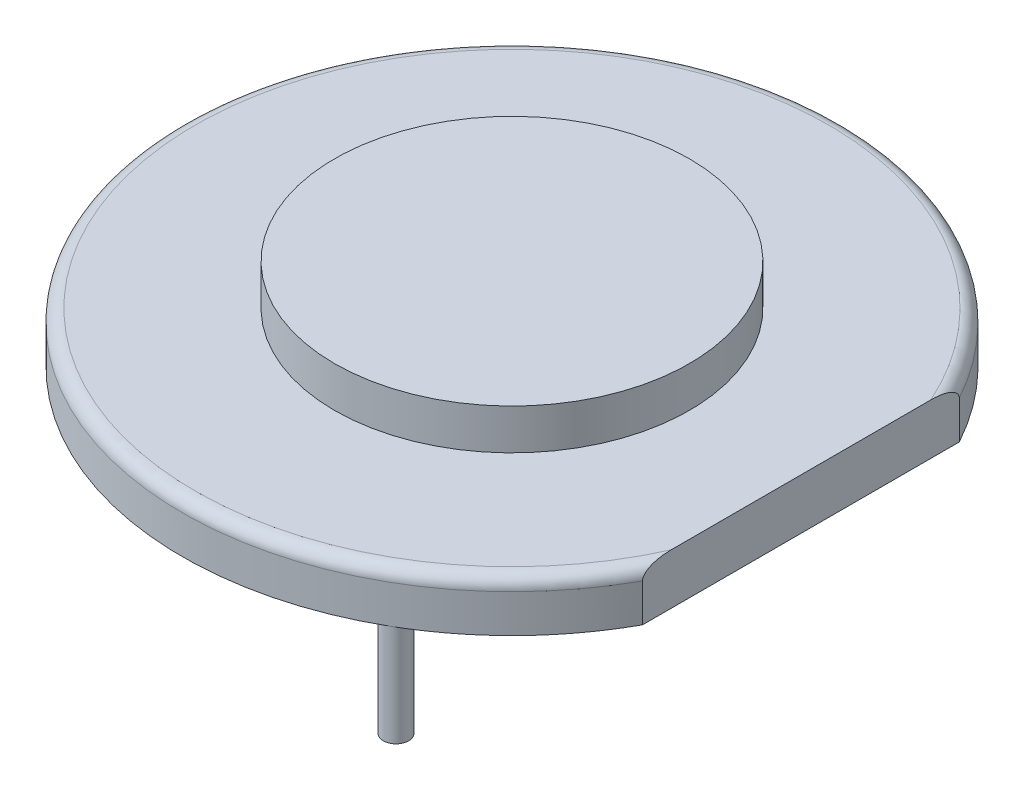
ISO-10303-21;
HEADER;
FILE_DESCRIPTION(('STEP AP214'),'2;1');
FILE_NAME('part.step','',(''),(''),'','','');
FILE_SCHEMA(('AUTOMOTIVE_DESIGN { 1 0 10303 214 1 1 1 1 }'));
ENDSEC;
DATA;
#1=APPLICATION_CONTEXT('core data for automotive mechanical design processes');
#2=APPLICATION_PROTOCOL_DEFINITION('international standard','automotive_design',2000,#1);
#3=PRODUCT_CONTEXT('',#1,'mechanical');
#4=PRODUCT('Part','Part','',(#3));
#5=PRODUCT_RELATED_PRODUCT_CATEGORY('part','',(#4));
#6=PRODUCT_DEFINITION_FORMATION('','',#4);
#7=PRODUCT_DEFINITION_CONTEXT('part definition',#1,'design');
#8=PRODUCT_DEFINITION('design','',#6,#7);
#9=PRODUCT_DEFINITION_SHAPE('','',#8);
#10=(LENGTH_UNIT() NAMED_UNIT(*) SI_UNIT(.MILLI.,.METRE.));
#11=(NAMED_UNIT(*) PLANE_ANGLE_UNIT() SI_UNIT($,.RADIAN.));
#12=(NAMED_UNIT(*) SI_UNIT($,.STERADIAN.) SOLID_ANGLE_UNIT());
#13=UNCERTAINTY_MEASURE_WITH_UNIT(LENGTH_MEASURE(1.E-05),#10,'distance_accuracy_value','');
#14=(GEOMETRIC_REPRESENTATION_CONTEXT(3) GLOBAL_UNCERTAINTY_ASSIGNED_CONTEXT((#13)) GLOBAL_UNIT_ASSIGNED_CONTEXT((#10,
#11,#12)) REPRESENTATION_CONTEXT('',''));
#15=CARTESIAN_POINT('',(0.,0.,0.));
#16=DIRECTION('',(0.,0.,1.));
#17=DIRECTION('',(1.,0.,0.));
#18=AXIS2_PLACEMENT_3D('',#15,#16,#17);
#19=CARTESIAN_POINT('',(0.,-1.,0.));
#20=DIRECTION('',(0.,1.,0.));
#21=DIRECTION('',(0.,0.,1.));
#22=AXIS2_PLACEMENT_3D('',#19,#20,#21);
#23=CYLINDRICAL_SURFACE('',#22,6.5);
#24=DIRECTION('',(0.,-1.,0.));
#25=VECTOR('',#24,1.);
#26=CARTESIAN_POINT('',(5.7,0.,3.12409987036266));
#27=LINE('',#26,#25);
#28=CARTESIAN_POINT('',(5.7,-0.25,3.12409987036266));
#29=VERTEX_POINT('',#28);
#30=CARTESIAN_POINT('',(5.7,-1.,3.12409987036266));
#31=VERTEX_POINT('',#30);
#32=EDGE_CURVE('E108',#29,#31,#27,.T.);
#33=ORIENTED_EDGE('',*,*,#32,.F.);
#34=CARTESIAN_POINT('',(0.,-0.25,0.));
#35=DIRECTION('',(0.,-1.,0.));
#36=DIRECTION('',(0.,0.,-1.));
#37=AXIS2_PLACEMENT_3D('',#34,#35,#36);
#38=CIRCLE('',#37,6.5);
#39=CARTESIAN_POINT('',(5.7,-0.25,-3.12409987036267));
#40=VERTEX_POINT('',#39);
#41=EDGE_CURVE('E122',#29,#40,#38,.T.);
#42=ORIENTED_EDGE('',*,*,#41,.T.);
#43=DIRECTION('',(0.,-1.,0.));
#44=VECTOR('',#43,1.);
#45=CARTESIAN_POINT('',(5.7,0.,-3.12409987036267));
#46=LINE('',#45,#44);
#47=CARTESIAN_POINT('',(5.7,-1.,-3.12409987036267));
#48=VERTEX_POINT('',#47);
#49=EDGE_CURVE('E296',#40,#48,#46,.T.);
#50=ORIENTED_EDGE('',*,*,#49,.T.);
#51=CARTESIAN_POINT('',(0.,-1.,0.));
#52=DIRECTION('',(0.,-1.,0.));
#53=DIRECTION('',(0.,0.,-1.));
#54=AXIS2_PLACEMENT_3D('',#51,#52,#53);
#55=CIRCLE('',#54,6.5);
#56=CARTESIAN_POINT('',(3.24999999999995,-1.,-5.62916512459888));
#57=VERTEX_POINT('',#56);
#58=EDGE_CURVE('E101',#57,#48,#55,.T.);
#59=ORIENTED_EDGE('',*,*,#58,.F.);
#60=CARTESIAN_POINT('',(-6.5,-1.,0.));
#61=VERTEX_POINT('',#60);
#62=EDGE_CURVE('E99',#61,#57,#55,.T.);
#63=ORIENTED_EDGE('',*,*,#62,.F.);
#64=CARTESIAN_POINT('',(3.25000000000003,-1.,5.62916512459884));
#65=VERTEX_POINT('',#64);
#66=EDGE_CURVE('E87',#65,#61,#55,.T.);
#67=ORIENTED_EDGE('',*,*,#66,.F.);
#68=EDGE_CURVE('E98',#31,#65,#55,.T.);
#69=ORIENTED_EDGE('',*,*,#68,.F.);
#70=EDGE_LOOP('',(#33,#42,#50,#59,#63,#67,#69));
#71=FACE_BOUND('',#70,.T.);
#72=ADVANCED_FACE('F43',(#71),#23,.T.);
#73=CARTESIAN_POINT('',(0.,-1.,0.));
#74=DIRECTION('',(0.,-1.,0.));
#75=DIRECTION('',(0.,0.,-1.));
#76=AXIS2_PLACEMENT_3D('',#73,#74,#75);
#77=PLANE('',#76);
#78=ORIENTED_EDGE('',*,*,#68,.T.);
#79=CARTESIAN_POINT('',(3.12500000000002,-1.,5.41265877365273));
#80=DIRECTION('',(0.,-1.,0.));
#81=DIRECTION('',(0.,0.,-1.));
#82=AXIS2_PLACEMENT_3D('',#79,#80,#81);
#83=CIRCLE('',#82,0.25);
#84=EDGE_CURVE('E94',#65,#65,#83,.T.);
#85=ORIENTED_EDGE('',*,*,#84,.F.);
#86=ORIENTED_EDGE('',*,*,#66,.T.);
#87=CARTESIAN_POINT('',(-6.25,-1.,0.));
#88=DIRECTION('',(0.,-1.,0.));
#89=DIRECTION('',(0.,0.,-1.));
#90=AXIS2_PLACEMENT_3D('',#87,#88,#89);
#91=CIRCLE('',#90,0.25);
#92=EDGE_CURVE('E93',#61,#61,#91,.T.);
#93=ORIENTED_EDGE('',*,*,#92,.F.);
#94=ORIENTED_EDGE('',*,*,#62,.T.);
#95=CARTESIAN_POINT('',(3.12499999999995,-1.,-5.41265877365277));
#96=DIRECTION('',(0.,-1.,0.));
#97=DIRECTION('',(0.,0.,-1.));
#98=AXIS2_PLACEMENT_3D('',#95,#96,#97);
#99=CIRCLE('',#98,0.25);
#100=EDGE_CURVE('E308',#57,#57,#99,.T.);
#101=ORIENTED_EDGE('',*,*,#100,.F.);
#102=ORIENTED_EDGE('',*,*,#58,.T.);
#103=DIRECTION('',(0.,0.,1.));
#104=VECTOR('',#103,1.);
#105=CARTESIAN_POINT('',(5.7,-1.,0.));
#106=LINE('',#105,#104);
#107=EDGE_CURVE('E300',#48,#31,#106,.T.);
#108=ORIENTED_EDGE('',*,*,#107,.T.);
#109=EDGE_LOOP('',(#78,#85,#86,#93,#94,#101,#102,#108));
#110=FACE_BOUND('',#109,.T.);
#111=ADVANCED_FACE('F90',(#110),#77,.T.);
#112=CARTESIAN_POINT('',(0.,0.,0.));
#113=DIRECTION('',(0.,-1.,0.));
#114=DIRECTION('',(0.,0.,-1.));
#115=AXIS2_PLACEMENT_3D('',#112,#113,#114);
#116=PLANE('',#115);
#117=CARTESIAN_POINT('',(0.,0.,0.));
#118=DIRECTION('',(0.,1.,0.));
#119=DIRECTION('',(0.,0.,1.));
#120=AXIS2_PLACEMENT_3D('',#117,#118,#119);
#121=CIRCLE('',#120,3.5);
#122=CARTESIAN_POINT('',(0.,0.,3.5));
#123=VERTEX_POINT('',#122);
#124=EDGE_CURVE('E112',#123,#123,#121,.T.);
#125=ORIENTED_EDGE('',*,*,#124,.F.);
#126=EDGE_LOOP('',(#125));
#127=FACE_BOUND('',#126,.T.);
#128=DIRECTION('',(0.,0.,1.));
#129=VECTOR('',#128,1.);
#130=CARTESIAN_POINT('',(5.7,0.,0.));
#131=LINE('',#130,#129);
#132=CARTESIAN_POINT('',(5.7,0.,-2.56368874865885));
#133=VERTEX_POINT('',#132);
#134=CARTESIAN_POINT('',(5.7,0.,2.56368874865885));
#135=VERTEX_POINT('',#134);
#136=EDGE_CURVE('E294',#133,#135,#131,.T.);
#137=ORIENTED_EDGE('',*,*,#136,.F.);
#138=CARTESIAN_POINT('',(0.,0.,0.));
#139=DIRECTION('',(0.,-1.,0.));
#140=DIRECTION('',(0.,0.,-1.));
#141=AXIS2_PLACEMENT_3D('',#138,#139,#140);
#142=CIRCLE('',#141,6.25);
#143=EDGE_CURVE('E11',#133,#135,#142,.F.);
#144=ORIENTED_EDGE('',*,*,#143,.T.);
#145=EDGE_LOOP('',(#137,#144));
#146=FACE_BOUND('',#145,.T.);
#147=ADVANCED_FACE('F149',(#127,#146),#116,.F.);
#148=CARTESIAN_POINT('',(0.,0.8,0.));
#149=DIRECTION('',(0.,-1.,0.));
#150=DIRECTION('',(0.,0.,-1.));
#151=AXIS2_PLACEMENT_3D('',#148,#149,#150);
#152=CYLINDRICAL_SURFACE('',#151,3.5);
#153=CARTESIAN_POINT('',(0.,0.8,0.));
#154=DIRECTION('',(0.,1.,0.));
#155=DIRECTION('',(0.,0.,1.));
#156=AXIS2_PLACEMENT_3D('',#153,#154,#155);
#157=CIRCLE('',#156,3.5);
#158=CARTESIAN_POINT('',(0.,0.8,3.5));
#159=VERTEX_POINT('',#158);
#160=EDGE_CURVE('E116',#159,#159,#157,.T.);
#161=ORIENTED_EDGE('',*,*,#160,.F.);
#162=EDGE_LOOP('',(#161));
#163=FACE_BOUND('',#162,.T.);
#164=ORIENTED_EDGE('',*,*,#124,.T.);
#165=EDGE_LOOP('',(#164));
#166=FACE_BOUND('',#165,.T.);
#167=ADVANCED_FACE('F152',(#163,#166),#152,.T.);
#168=CARTESIAN_POINT('',(0.,0.8,0.));
#169=DIRECTION('',(0.,1.,0.));
#170=DIRECTION('',(0.,0.,1.));
#171=AXIS2_PLACEMENT_3D('',#168,#169,#170);
#172=PLANE('',#171);
#173=ORIENTED_EDGE('',*,*,#160,.T.);
#174=EDGE_LOOP('',(#173));
#175=FACE_BOUND('',#174,.T.);
#176=ADVANCED_FACE('F144',(#175),#172,.T.);
#177=CARTESIAN_POINT('',(5.7,0.,0.));
#178=DIRECTION('',(1.,0.,0.));
#179=DIRECTION('',(0.,0.,-1.));
#180=AXIS2_PLACEMENT_3D('',#177,#178,#179);
#181=PLANE('',#180);
#182=ORIENTED_EDGE('',*,*,#49,.F.);
#183=CARTESIAN_POINT('',(5.7,-0.25,-3.12409987036267));
#184=CARTESIAN_POINT('',(5.7,-0.24270139711949,-3.12411790347937));
#185=CARTESIAN_POINT('',(5.7,-0.235425627069818,-3.12343582252596));
#186=CARTESIAN_POINT('',(5.7,-0.221173546532506,-3.12083654088536));
#187=CARTESIAN_POINT('',(5.7,-0.214194898182048,-3.11893234750161));
#188=CARTESIAN_POINT('',(5.7,-0.199088632378106,-3.11349263803758));
#189=CARTESIAN_POINT('',(5.7,-0.191060525611116,-3.10968465857683));
#190=CARTESIAN_POINT('',(5.7,-0.175706882548516,-3.10081499618159));
#191=CARTESIAN_POINT('',(5.7,-0.168384522831868,-3.09574798152024));
#192=CARTESIAN_POINT('',(5.7,-0.150718389128591,-3.08170819210007));
#193=CARTESIAN_POINT('',(5.7,-0.140880464647974,-3.07210455841439));
#194=CARTESIAN_POINT('',(5.7,-0.12275430626118,-3.05155610756302));
#195=CARTESIAN_POINT('',(5.7,-0.114468923105735,-3.04060888312734));
#196=CARTESIAN_POINT('',(5.7,-0.0925738390211234,-3.00803071204067));
#197=CARTESIAN_POINT('',(5.7,-0.0805516136635355,-2.98534354321277));
#198=CARTESIAN_POINT('',(5.7,-0.0596901424959992,-2.93846565774986));
#199=CARTESIAN_POINT('',(5.7,-0.0508732469623095,-2.91426571249646));
#200=CARTESIAN_POINT('',(5.7,-0.0350891539319967,-2.86296115134918));
#201=CARTESIAN_POINT('',(5.7,-0.0283504707873799,-2.83578733005097));
#202=CARTESIAN_POINT('',(5.7,-0.0172238791939065,-2.78092884006502));
#203=CARTESIAN_POINT('',(5.7,-0.0128404470011123,-2.75324330136007));
#204=CARTESIAN_POINT('',(5.7,-0.00616416122222058,-2.69856207103815));
#205=CARTESIAN_POINT('',(5.7,-0.0038067343169454,-2.6715739911406));
#206=CARTESIAN_POINT('',(5.7,-0.000735113779256635,-2.61761550312378));
#207=CARTESIAN_POINT('',(5.7,-1.40932183584515E-05,-2.59064549260658));
#208=CARTESIAN_POINT('',(5.7,0.,-2.56368874865885));
#209=B_SPLINE_CURVE_WITH_KNOTS('',3,(#183,#184,#185,#186,#187,#188,#189,#190,#191,#192,#193,
#194,#195,#196,#197,#198,#199,#200,#201,#202,#203,#204,#205,#206,#207,#208),.UNSPECIFIED.,.F.,
.F.,(4,2,2,2,2,2,2,2,2,2,2,2,4),(0.,0.0218270475864105,0.0434255514929194,0.0699346489562582,
0.0965579789665009,0.137569956262466,0.178656516554561,0.255254109403615,0.332376001142889,
0.416226983471425,0.500236769522998,0.581457537877483,0.662338833271093),.UNSPECIFIED.);
#210=EDGE_CURVE('E53',#40,#133,#209,.T.);
#211=ORIENTED_EDGE('',*,*,#210,.T.);
#212=ORIENTED_EDGE('',*,*,#136,.T.);
#213=CARTESIAN_POINT('',(5.7,0.,2.56368874865885));
#214=CARTESIAN_POINT('',(5.7,-1.4108370724459E-05,2.59058807505943));
#215=CARTESIAN_POINT('',(5.7,-0.00073207241316092,2.61750122529947));
#216=CARTESIAN_POINT('',(5.7,-0.00378976378290127,2.67133747283605));
#217=CARTESIAN_POINT('',(5.7,-0.00613574869164745,2.69826020651981));
#218=CARTESIAN_POINT('',(5.7,-0.0126636068477949,2.75186289164603));
#219=CARTESIAN_POINT('',(5.7,-0.0168437523248294,2.77854304751094));
#220=CARTESIAN_POINT('',(5.7,-0.0273775349103727,2.83144139799893));
#221=CARTESIAN_POINT('',(5.7,-0.033727337840529,2.85766032233706));
#222=CARTESIAN_POINT('',(5.7,-0.0462161795476339,2.89951849573819));
#223=CARTESIAN_POINT('',(5.7,-0.051524705692199,2.91540476003664));
#224=CARTESIAN_POINT('',(5.7,-0.0634049250575088,2.94677451747356));
#225=CARTESIAN_POINT('',(5.7,-0.0699812768017597,2.96225627839876));
#226=CARTESIAN_POINT('',(5.7,-0.0864288382515606,2.99620701488635));
#227=CARTESIAN_POINT('',(5.7,-0.0967125165836328,3.0144801670197));
#228=CARTESIAN_POINT('',(5.7,-0.120299401512833,3.04895021630178));
#229=CARTESIAN_POINT('',(5.7,-0.133580809238669,3.06516084286848));
#230=CARTESIAN_POINT('',(5.7,-0.155051789357852,3.08515083783441));
#231=CARTESIAN_POINT('',(5.7,-0.161643699430429,3.09063525165643));
#232=CARTESIAN_POINT('',(5.7,-0.175530582253784,3.10065794767847));
#233=CARTESIAN_POINT('',(5.7,-0.182825874042199,3.10519579755892));
#234=CARTESIAN_POINT('',(5.7,-0.198181190699516,3.11305947454442));
#235=CARTESIAN_POINT('',(5.7,-0.206250233540819,3.11636805670791));
#236=CARTESIAN_POINT('',(5.7,-0.222875656886606,3.12132072422689));
#237=CARTESIAN_POINT('',(5.7,-0.231429971651958,3.12297137687568));
#238=CARTESIAN_POINT('',(5.7,-0.241699624015103,3.12382480551173));
#239=CARTESIAN_POINT('',(5.7,-0.24335845106911,3.12392788943698));
#240=CARTESIAN_POINT('',(5.7,-0.246677960840215,3.12406528072464));
#241=CARTESIAN_POINT('',(5.7,-0.248338641854445,3.1240996291782));
#242=CARTESIAN_POINT('',(5.7,-0.25,3.12409987036266));
#243=B_SPLINE_CURVE_WITH_KNOTS('',3,(#213,#214,#215,#216,#217,#218,#219,#220,#221,#222,#223,
#224,#225,#226,#227,#228,#229,#230,#231,#232,#233,#234,#235,#236,#237,#238,#239,#240,#241,#242),
.UNSPECIFIED.,.F.,.F.,(4,2,2,2,2,2,2,2,2,2,2,2,2,2,4),(0.,0.0807102707969831,0.161732496351438,
0.242678562668563,0.323482316144011,0.373691305469444,0.424088426573866,0.486815269438852,
0.549099886624521,0.574762956707718,0.600437722220257,0.626460166791821,0.652379121375494,
0.657364470471326,0.662346838355262),.UNSPECIFIED.);
#244=EDGE_CURVE('E127',#135,#29,#243,.T.);
#245=ORIENTED_EDGE('',*,*,#244,.T.);
#246=ORIENTED_EDGE('',*,*,#32,.T.);
#247=ORIENTED_EDGE('',*,*,#107,.F.);
#248=EDGE_LOOP('',(#182,#211,#212,#245,#246,#247));
#249=FACE_BOUND('',#248,.T.);
#250=ADVANCED_FACE('F138',(#249),#181,.T.);
#251=CARTESIAN_POINT('',(-6.25,-3.,0.));
#252=DIRECTION('',(0.,1.,0.));
#253=DIRECTION('',(0.,0.,1.));
#254=AXIS2_PLACEMENT_3D('',#251,#252,#253);
#255=CYLINDRICAL_SURFACE('',#254,0.25);
#256=CARTESIAN_POINT('',(-6.25,-3.,0.));
#257=DIRECTION('',(0.,-1.,0.));
#258=DIRECTION('',(0.,0.,-1.));
#259=AXIS2_PLACEMENT_3D('',#256,#257,#258);
#260=CIRCLE('',#259,0.25);
#261=CARTESIAN_POINT('',(-6.25,-3.,-0.250000000000001));
#262=VERTEX_POINT('',#261);
#263=EDGE_CURVE('E303',#262,#262,#260,.T.);
#264=ORIENTED_EDGE('',*,*,#263,.F.);
#265=EDGE_LOOP('',(#264));
#266=FACE_BOUND('',#265,.T.);
#267=ORIENTED_EDGE('',*,*,#92,.T.);
#268=EDGE_LOOP('',(#267));
#269=FACE_BOUND('',#268,.T.);
#270=ADVANCED_FACE('F143',(#266,#269),#255,.T.);
#271=CARTESIAN_POINT('',(0.,-3.,0.));
#272=DIRECTION('',(0.,-1.,0.));
#273=DIRECTION('',(0.,0.,-1.));
#274=AXIS2_PLACEMENT_3D('',#271,#272,#273);
#275=PLANE('',#274);
#276=ORIENTED_EDGE('',*,*,#263,.T.);
#277=EDGE_LOOP('',(#276));
#278=FACE_BOUND('',#277,.T.);
#279=ADVANCED_FACE('F181',(#278),#275,.T.);
#280=CARTESIAN_POINT('',(3.12499999999995,-3.,-5.41265877365277));
#281=DIRECTION('',(0.,1.,0.));
#282=DIRECTION('',(0.,0.,1.));
#283=AXIS2_PLACEMENT_3D('',#280,#281,#282);
#284=CYLINDRICAL_SURFACE('',#283,0.25);
#285=CARTESIAN_POINT('',(3.12499999999995,-3.,-5.41265877365277));
#286=DIRECTION('',(0.,-1.,0.));
#287=DIRECTION('',(0.,0.,-1.));
#288=AXIS2_PLACEMENT_3D('',#285,#286,#287);
#289=CIRCLE('',#288,0.25);
#290=CARTESIAN_POINT('',(3.12499999999995,-3.,-5.66265877365277));
#291=VERTEX_POINT('',#290);
#292=EDGE_CURVE('E312',#291,#291,#289,.T.);
#293=ORIENTED_EDGE('',*,*,#292,.F.);
#294=EDGE_LOOP('',(#293));
#295=FACE_BOUND('',#294,.T.);
#296=ORIENTED_EDGE('',*,*,#100,.T.);
#297=EDGE_LOOP('',(#296));
#298=FACE_BOUND('',#297,.T.);
#299=ADVANCED_FACE('F188',(#295,#298),#284,.T.);
#300=CARTESIAN_POINT('',(0.,-3.,0.));
#301=DIRECTION('',(0.,-1.,0.));
#302=DIRECTION('',(0.,0.,-1.));
#303=AXIS2_PLACEMENT_3D('',#300,#301,#302);
#304=PLANE('',#303);
#305=ORIENTED_EDGE('',*,*,#292,.T.);
#306=EDGE_LOOP('',(#305));
#307=FACE_BOUND('',#306,.T.);
#308=ADVANCED_FACE('F195',(#307),#304,.T.);
#309=CARTESIAN_POINT('',(3.12500000000002,-3.,5.41265877365273));
#310=DIRECTION('',(0.,1.,0.));
#311=DIRECTION('',(0.,0.,1.));
#312=AXIS2_PLACEMENT_3D('',#309,#310,#311);
#313=CYLINDRICAL_SURFACE('',#312,0.25);
#314=CARTESIAN_POINT('',(3.12500000000002,-3.,5.41265877365273));
#315=DIRECTION('',(0.,-1.,0.));
#316=DIRECTION('',(0.,0.,-1.));
#317=AXIS2_PLACEMENT_3D('',#314,#315,#316);
#318=CIRCLE('',#317,0.25);
#319=CARTESIAN_POINT('',(3.12500000000002,-3.,5.16265877365273));
#320=VERTEX_POINT('',#319);
#321=EDGE_CURVE('E318',#320,#320,#318,.T.);
#322=ORIENTED_EDGE('',*,*,#321,.F.);
#323=EDGE_LOOP('',(#322));
#324=FACE_BOUND('',#323,.T.);
#325=ORIENTED_EDGE('',*,*,#84,.T.);
#326=EDGE_LOOP('',(#325));
#327=FACE_BOUND('',#326,.T.);
#328=ADVANCED_FACE('F203',(#324,#327),#313,.T.);
#329=CARTESIAN_POINT('',(3.12500000000002,-3.,5.41265877365273));
#330=DIRECTION('',(0.,-1.,0.));
#331=DIRECTION('',(0.,0.,-1.));
#332=AXIS2_PLACEMENT_3D('',#329,#330,#331);
#333=PLANE('',#332);
#334=ORIENTED_EDGE('',*,*,#321,.T.);
#335=EDGE_LOOP('',(#334));
#336=FACE_BOUND('',#335,.T.);
#337=ADVANCED_FACE('F211',(#336),#333,.T.);
#338=CARTESIAN_POINT('',(0.,-0.25,0.));
#339=DIRECTION('',(0.,-1.,0.));
#340=DIRECTION('',(0.,0.,-1.));
#341=AXIS2_PLACEMENT_3D('',#338,#339,#340);
#342=TOROIDAL_SURFACE('',#341,6.25,0.25);
#343=ORIENTED_EDGE('',*,*,#244,.F.);
#344=ORIENTED_EDGE('',*,*,#143,.F.);
#345=ORIENTED_EDGE('',*,*,#210,.F.);
#346=ORIENTED_EDGE('',*,*,#41,.F.);
#347=EDGE_LOOP('',(#343,#344,#345,#346));
#348=FACE_BOUND('',#347,.T.);
#349=ADVANCED_FACE('F45',(#348),#342,.T.);
#350=CLOSED_SHELL('',(#72,#111,#147,#167,#176,#250,#270,#279,#299,#308,#328,#337,#349));
#351=MANIFOLD_SOLID_BREP('B2',#350);
#352=ADVANCED_BREP_SHAPE_REPRESENTATION('',(#18,#351),#14);
#353=SHAPE_DEFINITION_REPRESENTATION(#9,#352);
ENDSEC;
END-ISO-10303-21;
